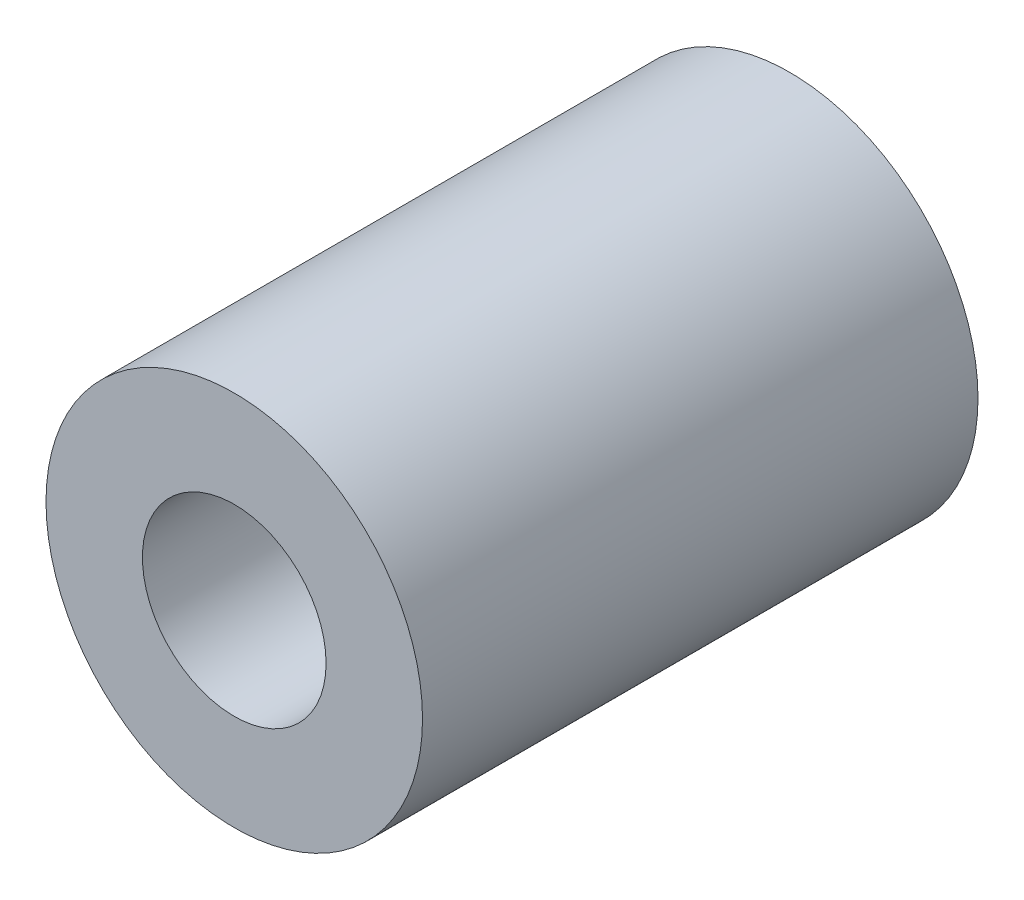
ISO-10303-21;
HEADER;
FILE_DESCRIPTION(('STEP AP214'),'2;1');
FILE_NAME('part.step','',(''),(''),'','','');
FILE_SCHEMA(('AUTOMOTIVE_DESIGN { 1 0 10303 214 1 1 1 1 }'));
ENDSEC;
DATA;
#1=APPLICATION_CONTEXT('core data for automotive mechanical design processes');
#2=APPLICATION_PROTOCOL_DEFINITION('international standard','automotive_design',2000,#1);
#3=PRODUCT_CONTEXT('',#1,'mechanical');
#4=PRODUCT('Part','Part','',(#3));
#5=PRODUCT_RELATED_PRODUCT_CATEGORY('part','',(#4));
#6=PRODUCT_DEFINITION_FORMATION('','',#4);
#7=PRODUCT_DEFINITION_CONTEXT('part definition',#1,'design');
#8=PRODUCT_DEFINITION('design','',#6,#7);
#9=PRODUCT_DEFINITION_SHAPE('','',#8);
#10=(LENGTH_UNIT() NAMED_UNIT(*) SI_UNIT(.MILLI.,.METRE.));
#11=(NAMED_UNIT(*) PLANE_ANGLE_UNIT() SI_UNIT($,.RADIAN.));
#12=(NAMED_UNIT(*) SI_UNIT($,.STERADIAN.) SOLID_ANGLE_UNIT());
#13=UNCERTAINTY_MEASURE_WITH_UNIT(LENGTH_MEASURE(1.E-05),#10,'distance_accuracy_value','');
#14=(GEOMETRIC_REPRESENTATION_CONTEXT(3) GLOBAL_UNCERTAINTY_ASSIGNED_CONTEXT((#13)) GLOBAL_UNIT_ASSIGNED_CONTEXT((#10,
#11,#12)) REPRESENTATION_CONTEXT('',''));
#15=CARTESIAN_POINT('',(0.,0.,0.));
#16=DIRECTION('',(0.,0.,1.));
#17=DIRECTION('',(1.,0.,0.));
#18=AXIS2_PLACEMENT_3D('',#15,#16,#17);
#19=CARTESIAN_POINT('',(0.,0.,75.2289300963749));
#20=DIRECTION('',(0.,0.,-1.));
#21=DIRECTION('',(-1.,0.,0.));
#22=AXIS2_PLACEMENT_3D('',#19,#20,#21);
#23=CYLINDRICAL_SURFACE('',#22,13.0175);
#24=CARTESIAN_POINT('',(0.,0.,0.));
#25=DIRECTION('',(0.,0.,1.));
#26=DIRECTION('',(1.,0.,0.));
#27=AXIS2_PLACEMENT_3D('',#24,#25,#26);
#28=CIRCLE('',#27,13.0175);
#29=CARTESIAN_POINT('',(13.0175,0.,0.));
#30=VERTEX_POINT('',#29);
#31=EDGE_CURVE('E44',#30,#30,#28,.T.);
#32=ORIENTED_EDGE('',*,*,#31,.T.);
#33=EDGE_LOOP('',(#32));
#34=FACE_BOUND('',#33,.T.);
#35=CARTESIAN_POINT('',(0.,0.,38.4098799999914));
#36=DIRECTION('',(0.,0.,1.));
#37=DIRECTION('',(1.,0.,0.));
#38=AXIS2_PLACEMENT_3D('',#35,#36,#37);
#39=CIRCLE('',#38,13.0175);
#40=CARTESIAN_POINT('',(13.0175,0.,38.4098799999913));
#41=VERTEX_POINT('',#40);
#42=EDGE_CURVE('E10',#41,#41,#39,.T.);
#43=ORIENTED_EDGE('',*,*,#42,.F.);
#44=EDGE_LOOP('',(#43));
#45=FACE_BOUND('',#44,.T.);
#46=ADVANCED_FACE('F37',(#34,#45),#23,.T.);
#47=CARTESIAN_POINT('',(0.,0.,0.));
#48=DIRECTION('',(0.,0.,1.));
#49=DIRECTION('',(1.,0.,0.));
#50=AXIS2_PLACEMENT_3D('',#47,#48,#49);
#51=PLANE('',#50);
#52=ORIENTED_EDGE('',*,*,#31,.F.);
#53=EDGE_LOOP('',(#52));
#54=FACE_BOUND('',#53,.T.);
#55=CARTESIAN_POINT('',(0.,0.,0.));
#56=DIRECTION('',(0.,0.,1.));
#57=DIRECTION('',(1.,0.,0.));
#58=AXIS2_PLACEMENT_3D('',#55,#56,#57);
#59=CIRCLE('',#58,6.35);
#60=CARTESIAN_POINT('',(6.35,0.,0.));
#61=VERTEX_POINT('',#60);
#62=EDGE_CURVE('E49',#61,#61,#59,.T.);
#63=ORIENTED_EDGE('',*,*,#62,.T.);
#64=EDGE_LOOP('',(#63));
#65=FACE_BOUND('',#64,.T.);
#66=ADVANCED_FACE('F65',(#54,#65),#51,.F.);
#67=CARTESIAN_POINT('',(0.,0.,75.2289300963749));
#68=DIRECTION('',(0.,0.,-1.));
#69=DIRECTION('',(-1.,0.,0.));
#70=AXIS2_PLACEMENT_3D('',#67,#68,#69);
#71=CYLINDRICAL_SURFACE('',#70,6.35);
#72=ORIENTED_EDGE('',*,*,#62,.F.);
#73=EDGE_LOOP('',(#72));
#74=FACE_BOUND('',#73,.T.);
#75=CARTESIAN_POINT('',(0.,0.,38.4098799999914));
#76=DIRECTION('',(0.,0.,1.));
#77=DIRECTION('',(1.,0.,0.));
#78=AXIS2_PLACEMENT_3D('',#75,#76,#77);
#79=CIRCLE('',#78,6.35);
#80=CARTESIAN_POINT('',(6.35,0.,38.4098799999913));
#81=VERTEX_POINT('',#80);
#82=EDGE_CURVE('E40',#81,#81,#79,.T.);
#83=ORIENTED_EDGE('',*,*,#82,.T.);
#84=EDGE_LOOP('',(#83));
#85=FACE_BOUND('',#84,.T.);
#86=ADVANCED_FACE('F57',(#74,#85),#71,.F.);
#87=CARTESIAN_POINT('',(6.48312779558702E-13,0.,38.4098799999914));
#88=DIRECTION('',(0.,0.,1.));
#89=DIRECTION('',(1.,0.,0.));
#90=AXIS2_PLACEMENT_3D('',#87,#88,#89);
#91=PLANE('',#90);
#92=ORIENTED_EDGE('',*,*,#82,.F.);
#93=EDGE_LOOP('',(#92));
#94=FACE_BOUND('',#93,.T.);
#95=ORIENTED_EDGE('',*,*,#42,.T.);
#96=EDGE_LOOP('',(#95));
#97=FACE_BOUND('',#96,.T.);
#98=ADVANCED_FACE('F59',(#94,#97),#91,.T.);
#99=CLOSED_SHELL('',(#46,#66,#86,#98));
#100=MANIFOLD_SOLID_BREP('B2',#99);
#101=ADVANCED_BREP_SHAPE_REPRESENTATION('',(#18,#100),#14);
#102=SHAPE_DEFINITION_REPRESENTATION(#9,#101);
ENDSEC;
END-ISO-10303-21;
